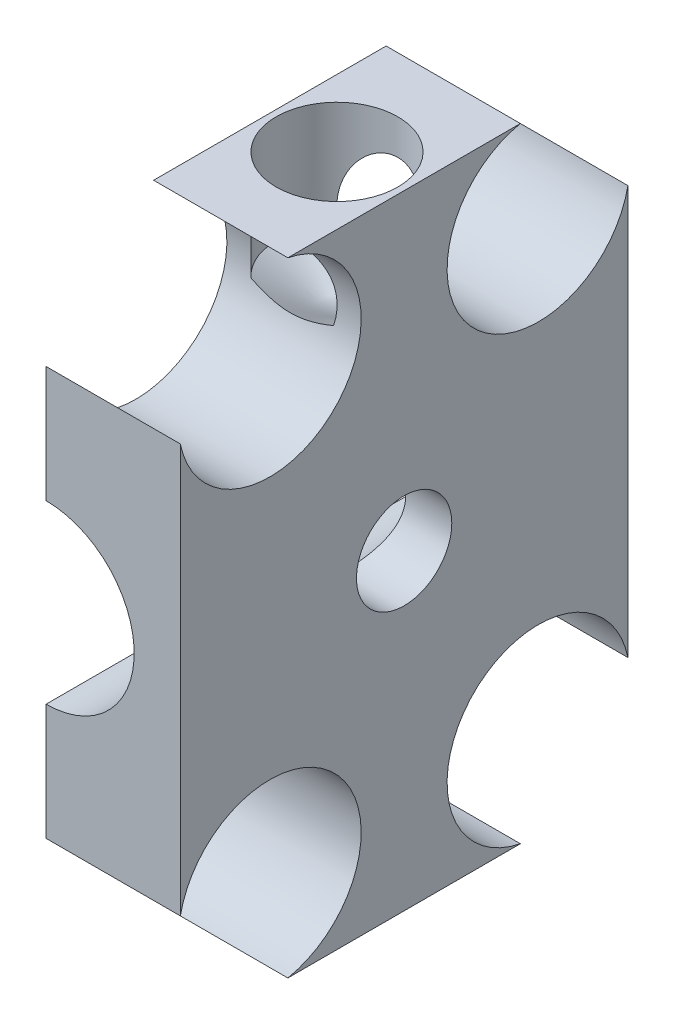
ISO-10303-21;
HEADER;
FILE_DESCRIPTION(('STEP AP214'),'2;1');
FILE_NAME('part.step','',(''),(''),'','','');
FILE_SCHEMA(('AUTOMOTIVE_DESIGN { 1 0 10303 214 1 1 1 1 }'));
ENDSEC;
DATA;
#1=APPLICATION_CONTEXT('core data for automotive mechanical design processes');
#2=APPLICATION_PROTOCOL_DEFINITION('international standard','automotive_design',2000,#1);
#3=PRODUCT_CONTEXT('',#1,'mechanical');
#4=PRODUCT('Part','Part','',(#3));
#5=PRODUCT_RELATED_PRODUCT_CATEGORY('part','',(#4));
#6=PRODUCT_DEFINITION_FORMATION('','',#4);
#7=PRODUCT_DEFINITION_CONTEXT('part definition',#1,'design');
#8=PRODUCT_DEFINITION('design','',#6,#7);
#9=PRODUCT_DEFINITION_SHAPE('','',#8);
#10=(LENGTH_UNIT() NAMED_UNIT(*) SI_UNIT(.MILLI.,.METRE.));
#11=(NAMED_UNIT(*) PLANE_ANGLE_UNIT() SI_UNIT($,.RADIAN.));
#12=(NAMED_UNIT(*) SI_UNIT($,.STERADIAN.) SOLID_ANGLE_UNIT());
#13=UNCERTAINTY_MEASURE_WITH_UNIT(LENGTH_MEASURE(1.E-05),#10,'distance_accuracy_value','');
#14=(GEOMETRIC_REPRESENTATION_CONTEXT(3) GLOBAL_UNCERTAINTY_ASSIGNED_CONTEXT((#13)) GLOBAL_UNIT_ASSIGNED_CONTEXT((#10,
#11,#12)) REPRESENTATION_CONTEXT('',''));
#15=CARTESIAN_POINT('',(0.,0.,0.));
#16=DIRECTION('',(0.,0.,1.));
#17=DIRECTION('',(1.,0.,0.));
#18=AXIS2_PLACEMENT_3D('',#15,#16,#17);
#19=CARTESIAN_POINT('',(0.,0.,6.35));
#20=DIRECTION('',(0.,0.,1.));
#21=DIRECTION('',(1.,0.,0.));
#22=AXIS2_PLACEMENT_3D('',#19,#20,#21);
#23=PLANE('',#22);
#24=DIRECTION('',(1.,0.,0.));
#25=VECTOR('',#24,1.);
#26=CARTESIAN_POINT('',(3.81,5.79946131844707,6.35));
#27=LINE('',#26,#25);
#28=CARTESIAN_POINT('',(0.,5.79946131844707,6.35));
#29=VERTEX_POINT('',#28);
#30=CARTESIAN_POINT('',(3.81,5.79946131844707,6.35));
#31=VERTEX_POINT('',#30);
#32=EDGE_CURVE('E139',#29,#31,#27,.T.);
#33=ORIENTED_EDGE('',*,*,#32,.F.);
#34=DIRECTION('',(0.,1.,0.));
#35=VECTOR('',#34,1.);
#36=CARTESIAN_POINT('',(0.,0.,6.35));
#37=LINE('',#36,#35);
#38=CARTESIAN_POINT('',(0.,2.499995,6.35));
#39=VERTEX_POINT('',#38);
#40=EDGE_CURVE('E170',#39,#29,#37,.T.);
#41=ORIENTED_EDGE('',*,*,#40,.F.);
#42=CARTESIAN_POINT('',(0.,0.,6.35));
#43=DIRECTION('',(0.,0.,1.));
#44=DIRECTION('',(1.,0.,0.));
#45=AXIS2_PLACEMENT_3D('',#42,#43,#44);
#46=CIRCLE('',#45,2.499995);
#47=CARTESIAN_POINT('',(0.,-2.499995,6.35));
#48=VERTEX_POINT('',#47);
#49=EDGE_CURVE('E262',#48,#39,#46,.T.);
#50=ORIENTED_EDGE('',*,*,#49,.F.);
#51=DIRECTION('',(0.,1.,0.));
#52=VECTOR('',#51,1.);
#53=CARTESIAN_POINT('',(0.,0.,6.35));
#54=LINE('',#53,#52);
#55=CARTESIAN_POINT('',(0.,-5.79946131844707,6.35));
#56=VERTEX_POINT('',#55);
#57=EDGE_CURVE('E245',#56,#48,#54,.T.);
#58=ORIENTED_EDGE('',*,*,#57,.F.);
#59=DIRECTION('',(1.,0.,0.));
#60=VECTOR('',#59,1.);
#61=CARTESIAN_POINT('',(3.81,-5.79946131844707,6.35));
#62=LINE('',#61,#60);
#63=CARTESIAN_POINT('',(3.81,-5.79946131844706,6.35));
#64=VERTEX_POINT('',#63);
#65=EDGE_CURVE('E159',#64,#56,#62,.F.);
#66=ORIENTED_EDGE('',*,*,#65,.F.);
#67=DIRECTION('',(0.,-1.,0.));
#68=VECTOR('',#67,1.);
#69=CARTESIAN_POINT('',(3.81,0.,6.35));
#70=LINE('',#69,#68);
#71=EDGE_CURVE('E152',#31,#64,#70,.T.);
#72=ORIENTED_EDGE('',*,*,#71,.F.);
#73=EDGE_LOOP('',(#33,#41,#50,#58,#66,#72));
#74=FACE_BOUND('',#73,.T.);
#75=ADVANCED_FACE('F47',(#74),#23,.T.);
#76=CARTESIAN_POINT('',(3.81,0.,6.35));
#77=DIRECTION('',(1.,0.,0.));
#78=DIRECTION('',(0.,0.,-1.));
#79=AXIS2_PLACEMENT_3D('',#76,#77,#78);
#80=PLANE('',#79);
#81=CARTESIAN_POINT('',(3.81,6.309995,3.81));
#82=DIRECTION('',(1.,0.,0.));
#83=DIRECTION('',(0.,0.,-1.));
#84=AXIS2_PLACEMENT_3D('',#81,#82,#83);
#85=CIRCLE('',#84,2.5908);
#86=CARTESIAN_POINT('',(3.81,8.849995,3.29946631844707));
#87=VERTEX_POINT('',#86);
#88=EDGE_CURVE('E52',#31,#87,#85,.T.);
#89=ORIENTED_EDGE('',*,*,#88,.F.);
#90=ORIENTED_EDGE('',*,*,#71,.T.);
#91=CARTESIAN_POINT('',(3.81,-6.309995,3.81));
#92=DIRECTION('',(1.,0.,0.));
#93=DIRECTION('',(0.,0.,-1.));
#94=AXIS2_PLACEMENT_3D('',#91,#92,#93);
#95=CIRCLE('',#94,2.5908);
#96=CARTESIAN_POINT('',(3.81,-8.849995,3.29946631844707));
#97=VERTEX_POINT('',#96);
#98=EDGE_CURVE('E237',#97,#64,#95,.T.);
#99=ORIENTED_EDGE('',*,*,#98,.F.);
#100=DIRECTION('',(0.,0.,-1.));
#101=VECTOR('',#100,1.);
#102=CARTESIAN_POINT('',(3.81,-8.849995,6.35));
#103=LINE('',#102,#101);
#104=CARTESIAN_POINT('',(3.81,-8.849995,-3.29946631844707));
#105=VERTEX_POINT('',#104);
#106=EDGE_CURVE('E161',#97,#105,#103,.T.);
#107=ORIENTED_EDGE('',*,*,#106,.T.);
#108=CARTESIAN_POINT('',(3.81,-6.309995,-3.81));
#109=DIRECTION('',(1.,0.,0.));
#110=DIRECTION('',(0.,0.,-1.));
#111=AXIS2_PLACEMENT_3D('',#108,#109,#110);
#112=CIRCLE('',#111,2.5908);
#113=CARTESIAN_POINT('',(3.81,-5.79946131844706,-6.35));
#114=VERTEX_POINT('',#113);
#115=EDGE_CURVE('E337',#114,#105,#112,.T.);
#116=ORIENTED_EDGE('',*,*,#115,.F.);
#117=DIRECTION('',(0.,-1.,0.));
#118=VECTOR('',#117,1.);
#119=CARTESIAN_POINT('',(3.81,0.,-6.35));
#120=LINE('',#119,#118);
#121=CARTESIAN_POINT('',(3.81,5.79946131844707,-6.35));
#122=VERTEX_POINT('',#121);
#123=EDGE_CURVE('E169',#122,#114,#120,.T.);
#124=ORIENTED_EDGE('',*,*,#123,.F.);
#125=CARTESIAN_POINT('',(3.81,6.309995,-3.81));
#126=DIRECTION('',(1.,0.,0.));
#127=DIRECTION('',(0.,0.,-1.));
#128=AXIS2_PLACEMENT_3D('',#125,#126,#127);
#129=CIRCLE('',#128,2.5908);
#130=CARTESIAN_POINT('',(3.81,8.849995,-3.29946631844707));
#131=VERTEX_POINT('',#130);
#132=EDGE_CURVE('E331',#131,#122,#129,.T.);
#133=ORIENTED_EDGE('',*,*,#132,.F.);
#134=DIRECTION('',(0.,0.,-1.));
#135=VECTOR('',#134,1.);
#136=CARTESIAN_POINT('',(3.81,8.849995,6.35));
#137=LINE('',#136,#135);
#138=EDGE_CURVE('E155',#87,#131,#137,.T.);
#139=ORIENTED_EDGE('',*,*,#138,.F.);
#140=EDGE_LOOP('',(#89,#90,#99,#107,#116,#124,#133,#139));
#141=FACE_BOUND('',#140,.T.);
#142=CARTESIAN_POINT('',(3.81,0.,0.));
#143=DIRECTION('',(1.,0.,0.));
#144=DIRECTION('',(0.,0.,-1.));
#145=AXIS2_PLACEMENT_3D('',#142,#143,#144);
#146=CIRCLE('',#145,1.35255);
#147=CARTESIAN_POINT('',(3.81,0.,-1.35255));
#148=VERTEX_POINT('',#147);
#149=EDGE_CURVE('E251',#148,#148,#146,.T.);
#150=ORIENTED_EDGE('',*,*,#149,.F.);
#151=EDGE_LOOP('',(#150));
#152=FACE_BOUND('',#151,.T.);
#153=ADVANCED_FACE('F149',(#141,#152),#80,.T.);
#154=CARTESIAN_POINT('',(0.,8.849995,6.35));
#155=DIRECTION('',(0.,1.,0.));
#156=DIRECTION('',(0.,0.,1.));
#157=AXIS2_PLACEMENT_3D('',#154,#155,#156);
#158=PLANE('',#157);
#159=DIRECTION('',(1.,0.,0.));
#160=VECTOR('',#159,1.);
#161=CARTESIAN_POINT('',(3.81,8.849995,3.29946631844707));
#162=LINE('',#161,#160);
#163=CARTESIAN_POINT('',(0.,8.849995,3.29946631844707));
#164=VERTEX_POINT('',#163);
#165=EDGE_CURVE('E59',#87,#164,#162,.F.);
#166=ORIENTED_EDGE('',*,*,#165,.F.);
#167=ORIENTED_EDGE('',*,*,#138,.T.);
#168=DIRECTION('',(1.,0.,0.));
#169=VECTOR('',#168,1.);
#170=CARTESIAN_POINT('',(3.81,8.849995,-3.29946631844707));
#171=LINE('',#170,#169);
#172=CARTESIAN_POINT('',(0.,8.849995,-3.29946631844707));
#173=VERTEX_POINT('',#172);
#174=EDGE_CURVE('E244',#173,#131,#171,.T.);
#175=ORIENTED_EDGE('',*,*,#174,.F.);
#176=DIRECTION('',(0.,0.,-1.));
#177=VECTOR('',#176,1.);
#178=CARTESIAN_POINT('',(0.,8.849995,6.35));
#179=LINE('',#178,#177);
#180=EDGE_CURVE('E174',#164,#173,#179,.T.);
#181=ORIENTED_EDGE('',*,*,#180,.F.);
#182=EDGE_LOOP('',(#166,#167,#175,#181));
#183=FACE_BOUND('',#182,.T.);
#184=CARTESIAN_POINT('',(1.905,8.849995,0.));
#185=DIRECTION('',(0.,1.,0.));
#186=DIRECTION('',(0.,0.,1.));
#187=AXIS2_PLACEMENT_3D('',#184,#185,#186);
#188=CIRCLE('',#187,1.72719999999999);
#189=CARTESIAN_POINT('',(1.905,8.849995,1.72719999999999));
#190=VERTEX_POINT('',#189);
#191=EDGE_CURVE('E234',#190,#190,#188,.T.);
#192=ORIENTED_EDGE('',*,*,#191,.F.);
#193=EDGE_LOOP('',(#192));
#194=FACE_BOUND('',#193,.T.);
#195=ADVANCED_FACE('F299',(#183,#194),#158,.T.);
#196=CARTESIAN_POINT('',(0.,0.,-6.35));
#197=DIRECTION('',(0.,0.,1.));
#198=DIRECTION('',(1.,0.,0.));
#199=AXIS2_PLACEMENT_3D('',#196,#197,#198);
#200=PLANE('',#199);
#201=ORIENTED_EDGE('',*,*,#123,.T.);
#202=DIRECTION('',(1.,0.,0.));
#203=VECTOR('',#202,1.);
#204=CARTESIAN_POINT('',(3.81,-5.79946131844707,-6.35));
#205=LINE('',#204,#203);
#206=CARTESIAN_POINT('',(0.,-5.79946131844707,-6.35));
#207=VERTEX_POINT('',#206);
#208=EDGE_CURVE('E235',#114,#207,#205,.F.);
#209=ORIENTED_EDGE('',*,*,#208,.T.);
#210=DIRECTION('',(0.,1.,0.));
#211=VECTOR('',#210,1.);
#212=CARTESIAN_POINT('',(0.,0.,-6.35));
#213=LINE('',#212,#211);
#214=CARTESIAN_POINT('',(0.,-2.499995,-6.35));
#215=VERTEX_POINT('',#214);
#216=EDGE_CURVE('E271',#207,#215,#213,.T.);
#217=ORIENTED_EDGE('',*,*,#216,.T.);
#218=CARTESIAN_POINT('',(0.,0.,-6.35));
#219=DIRECTION('',(0.,0.,1.));
#220=DIRECTION('',(1.,0.,0.));
#221=AXIS2_PLACEMENT_3D('',#218,#219,#220);
#222=CIRCLE('',#221,2.499995);
#223=CARTESIAN_POINT('',(0.,2.499995,-6.35));
#224=VERTEX_POINT('',#223);
#225=EDGE_CURVE('E267',#215,#224,#222,.T.);
#226=ORIENTED_EDGE('',*,*,#225,.T.);
#227=DIRECTION('',(0.,1.,0.));
#228=VECTOR('',#227,1.);
#229=CARTESIAN_POINT('',(0.,0.,-6.35));
#230=LINE('',#229,#228);
#231=CARTESIAN_POINT('',(0.,5.79946131844707,-6.35));
#232=VERTEX_POINT('',#231);
#233=EDGE_CURVE('E213',#224,#232,#230,.T.);
#234=ORIENTED_EDGE('',*,*,#233,.T.);
#235=DIRECTION('',(1.,0.,0.));
#236=VECTOR('',#235,1.);
#237=CARTESIAN_POINT('',(3.81,5.79946131844707,-6.35));
#238=LINE('',#237,#236);
#239=EDGE_CURVE('E211',#232,#122,#238,.T.);
#240=ORIENTED_EDGE('',*,*,#239,.T.);
#241=EDGE_LOOP('',(#201,#209,#217,#226,#234,#240));
#242=FACE_BOUND('',#241,.T.);
#243=ADVANCED_FACE('F296',(#242),#200,.F.);
#244=CARTESIAN_POINT('',(0.,0.,6.35));
#245=DIRECTION('',(-1.,0.,0.));
#246=DIRECTION('',(0.,0.,1.));
#247=AXIS2_PLACEMENT_3D('',#244,#245,#246);
#248=PLANE('',#247);
#249=CARTESIAN_POINT('',(0.,-6.309995,-3.81));
#250=DIRECTION('',(-1.,0.,0.));
#251=DIRECTION('',(0.,0.,1.));
#252=AXIS2_PLACEMENT_3D('',#249,#250,#251);
#253=CIRCLE('',#252,2.5908);
#254=CARTESIAN_POINT('',(0.,-8.849995,-3.29946631844707));
#255=VERTEX_POINT('',#254);
#256=EDGE_CURVE('E145',#255,#207,#253,.T.);
#257=ORIENTED_EDGE('',*,*,#256,.F.);
#258=DIRECTION('',(0.,0.,-1.));
#259=VECTOR('',#258,1.);
#260=CARTESIAN_POINT('',(0.,-8.849995,6.35));
#261=LINE('',#260,#259);
#262=CARTESIAN_POINT('',(0.,-8.849995,3.29946631844707));
#263=VERTEX_POINT('',#262);
#264=EDGE_CURVE('E266',#263,#255,#261,.T.);
#265=ORIENTED_EDGE('',*,*,#264,.F.);
#266=CARTESIAN_POINT('',(0.,-6.309995,3.81));
#267=DIRECTION('',(-1.,0.,0.));
#268=DIRECTION('',(0.,0.,1.));
#269=AXIS2_PLACEMENT_3D('',#266,#267,#268);
#270=CIRCLE('',#269,2.5908);
#271=EDGE_CURVE('E241',#56,#263,#270,.T.);
#272=ORIENTED_EDGE('',*,*,#271,.F.);
#273=ORIENTED_EDGE('',*,*,#57,.T.);
#274=DIRECTION('',(0.,0.,-1.));
#275=VECTOR('',#274,1.);
#276=CARTESIAN_POINT('',(0.,-2.499995,6.35));
#277=LINE('',#276,#275);
#278=EDGE_CURVE('E248',#48,#215,#277,.T.);
#279=ORIENTED_EDGE('',*,*,#278,.T.);
#280=ORIENTED_EDGE('',*,*,#216,.F.);
#281=EDGE_LOOP('',(#257,#265,#272,#273,#279,#280));
#282=FACE_BOUND('',#281,.T.);
#283=ADVANCED_FACE('F294',(#282),#248,.T.);
#284=CARTESIAN_POINT('',(0.,-8.849995,6.35));
#285=DIRECTION('',(0.,-1.,0.));
#286=DIRECTION('',(0.,0.,-1.));
#287=AXIS2_PLACEMENT_3D('',#284,#285,#286);
#288=PLANE('',#287);
#289=DIRECTION('',(1.,0.,0.));
#290=VECTOR('',#289,1.);
#291=CARTESIAN_POINT('',(3.81,-8.849995,-3.29946631844707));
#292=LINE('',#291,#290);
#293=EDGE_CURVE('E339',#105,#255,#292,.F.);
#294=ORIENTED_EDGE('',*,*,#293,.F.);
#295=ORIENTED_EDGE('',*,*,#106,.F.);
#296=DIRECTION('',(1.,0.,0.));
#297=VECTOR('',#296,1.);
#298=CARTESIAN_POINT('',(3.81,-8.849995,3.29946631844707));
#299=LINE('',#298,#297);
#300=EDGE_CURVE('E240',#263,#97,#299,.T.);
#301=ORIENTED_EDGE('',*,*,#300,.F.);
#302=ORIENTED_EDGE('',*,*,#264,.T.);
#303=EDGE_LOOP('',(#294,#295,#301,#302));
#304=FACE_BOUND('',#303,.T.);
#305=ADVANCED_FACE('F291',(#304),#288,.T.);
#306=CARTESIAN_POINT('',(0.,0.,6.35));
#307=DIRECTION('',(0.,0.,-1.));
#308=DIRECTION('',(-1.,0.,0.));
#309=AXIS2_PLACEMENT_3D('',#306,#307,#308);
#310=CYLINDRICAL_SURFACE('',#309,2.499995);
#311=CARTESIAN_POINT('',(2.499995,0.,-1.35255));
#312=CARTESIAN_POINT('',(2.4999909417952,-0.0703879854908671,-1.35254547654858));
#313=CARTESIAN_POINT('',(2.49699175387842,-0.140837953186034,-1.34702354530672));
#314=CARTESIAN_POINT('',(2.48528915677381,-0.279610593337236,-1.32520194487222));
#315=CARTESIAN_POINT('',(2.47657739390966,-0.347929996699159,-1.30888649166548));
#316=CARTESIAN_POINT('',(2.45435024710423,-0.480232220483703,-1.26632484428661));
#317=CARTESIAN_POINT('',(2.44085448417952,-0.544231501662716,-1.24011918565623));
#318=CARTESIAN_POINT('',(2.4102582135294,-0.666803425482456,-1.17875667214856));
#319=CARTESIAN_POINT('',(2.39315762466794,-0.725375945937003,-1.14359961579294));
#320=CARTESIAN_POINT('',(2.35551902442998,-0.83986699701009,-1.06266453772066));
#321=CARTESIAN_POINT('',(2.33482707539279,-0.895341133167189,-1.01633068841118));
#322=CARTESIAN_POINT('',(2.29276302610907,-0.998150314810456,-0.915574111767863));
#323=CARTESIAN_POINT('',(2.27139033218946,-1.04547801199676,-0.861144163172528));
#324=CARTESIAN_POINT('',(2.22802227102003,-1.13516552630285,-0.739607520961648));
#325=CARTESIAN_POINT('',(2.20615906586732,-1.17663265559082,-0.671788849342804));
#326=CARTESIAN_POINT('',(2.16693209187687,-1.24740812580324,-0.528874433738393));
#327=CARTESIAN_POINT('',(2.14956480839281,-1.27672597515602,-0.453784437533482));
#328=CARTESIAN_POINT('',(2.12305705429654,-1.32031153876476,-0.303175886947697));
#329=CARTESIAN_POINT('',(2.11346795145699,-1.33540968327565,-0.227981175996748));
#330=CARTESIAN_POINT('',(2.10251079692312,-1.35260504099723,-0.0755693134265723));
#331=CARTESIAN_POINT('',(2.10113173945947,-1.35471965906621,0.00164499126287952));
#332=CARTESIAN_POINT('',(2.10640355153818,-1.34649347176087,0.143731859929031));
#333=CARTESIAN_POINT('',(2.11191195204005,-1.33792530028466,0.208761092329506));
#334=CARTESIAN_POINT('',(2.12829808822594,-1.31170086618424,0.336259264264827));
#335=CARTESIAN_POINT('',(2.13917810976783,-1.29404073439939,0.398727101547353));
#336=CARTESIAN_POINT('',(2.16528093213309,-1.2498799431391,0.521074954059483));
#337=CARTESIAN_POINT('',(2.18059436381576,-1.22319259735765,0.580867310954306));
#338=CARTESIAN_POINT('',(2.21386482490899,-1.16189197944697,0.695431077072122));
#339=CARTESIAN_POINT('',(2.23182301257873,-1.12727523096321,0.750200269281502));
#340=CARTESIAN_POINT('',(2.27164279923057,-1.04498998351744,0.861918053175414));
#341=CARTESIAN_POINT('',(2.29368300703626,-0.996137723794657,0.917934353382224));
#342=CARTESIAN_POINT('',(2.33701607327133,-0.889737679311177,1.02140573477245));
#343=CARTESIAN_POINT('',(2.35830844360215,-0.832184340883776,1.06885530529083));
#344=CARTESIAN_POINT('',(2.39936643900902,-0.705490975530968,1.15671025296739));
#345=CARTESIAN_POINT('',(2.41895162974972,-0.635849684512623,1.19648432311302));
#346=CARTESIAN_POINT('',(2.45274040459833,-0.489546582115155,1.26340373944106));
#347=CARTESIAN_POINT('',(2.46694890901077,-0.41289126957455,1.29056063704003));
#348=CARTESIAN_POINT('',(2.4872576260959,-0.262230952139805,1.32894908875345));
#349=CARTESIAN_POINT('',(2.49398029731656,-0.188624204053558,1.3414094669068));
#350=CARTESIAN_POINT('',(2.50077665237163,-0.0400743499299487,1.35400571303525));
#351=CARTESIAN_POINT('',(2.50085436246898,0.0348679193624996,1.35414904405963));
#352=CARTESIAN_POINT('',(2.49467312946835,0.176440456468771,1.34269394270928));
#353=CARTESIAN_POINT('',(2.48900859984121,0.243190360257094,1.33219695920549));
#354=CARTESIAN_POINT('',(2.47276573429862,0.373814872855549,1.30159698728912));
#355=CARTESIAN_POINT('',(2.46218689378422,0.437689185662504,1.28149301242944));
#356=CARTESIAN_POINT('',(2.43673138967285,0.56256183283884,1.23188450927183));
#357=CARTESIAN_POINT('',(2.42175823922533,0.62345524002044,1.20216721058017));
#358=CARTESIAN_POINT('',(2.38886448517946,0.739559436343362,1.1344450819809));
#359=CARTESIAN_POINT('',(2.37094276429433,0.794768058434945,1.09643710874457));
#360=CARTESIAN_POINT('',(2.33148466761163,0.904382499660284,1.00843981683581));
#361=CARTESIAN_POINT('',(2.30976743234877,0.958036005181737,0.957593575258703));
#362=CARTESIAN_POINT('',(2.26644918154136,1.05644693728278,0.84779405512753));
#363=CARTESIAN_POINT('',(2.24484829992829,1.10119564075325,0.78883292194691));
#364=CARTESIAN_POINT('',(2.20254359895675,1.18367104078955,0.659261807736754));
#365=CARTESIAN_POINT('',(2.18201649300806,1.22065968518861,0.588118649246095));
#366=CARTESIAN_POINT('',(2.14669371530733,1.28177270904628,0.439207092856885));
#367=CARTESIAN_POINT('',(2.13188978259034,1.30591564939898,0.36144844335765));
#368=CARTESIAN_POINT('',(2.11172752197848,1.33825051908923,0.209529141857859));
#369=CARTESIAN_POINT('',(2.10558785875075,1.34777008096413,0.135758853931323));
#370=CARTESIAN_POINT('',(2.10125342479613,1.35452272423138,-0.0125532494118207));
#371=CARTESIAN_POINT('',(2.10305263144254,1.35176511937746,-0.0870944371878129));
#372=CARTESIAN_POINT('',(2.11351466773017,1.33532737631793,-0.224652447697519));
#373=CARTESIAN_POINT('',(2.1212683272018,1.32309232598415,-0.287921919647346));
#374=CARTESIAN_POINT('',(2.14151945291965,1.29005526648468,-0.411381785045474));
#375=CARTESIAN_POINT('',(2.15401875832477,1.26924993567011,-0.471570974465318));
#376=CARTESIAN_POINT('',(2.18329432029195,1.21824235868599,-0.591426849397039));
#377=CARTESIAN_POINT('',(2.2002907534723,1.18752983439671,-0.650820709391653));
#378=CARTESIAN_POINT('',(2.23638386774575,1.11807600905081,-0.764010626719821));
#379=CARTESIAN_POINT('',(2.25548167282124,1.0793304013632,-0.817803658049328));
#380=CARTESIAN_POINT('',(2.29705425127217,0.988123251305441,-0.926701862105477));
#381=CARTESIAN_POINT('',(2.31960531219547,0.934475602537718,-0.980790005556026));
#382=CARTESIAN_POINT('',(2.36304594400469,0.818429765175733,-1.07952278168452));
#383=CARTESIAN_POINT('',(2.38393438135915,0.75602568543014,-1.12416100550092));
#384=CARTESIAN_POINT('',(2.42248101087233,0.621753290808111,-1.20377712737638));
#385=CARTESIAN_POINT('',(2.4400282611623,0.549663393303364,-1.23843816929756));
#386=CARTESIAN_POINT('',(2.46904288206818,0.39950503743125,-1.29467167170197));
#387=CARTESIAN_POINT('',(2.48052619243088,0.32145287675783,-1.31627846852599));
#388=CARTESIAN_POINT('',(2.4921384966697,0.202071130048963,-1.33798420669402));
#389=CARTESIAN_POINT('',(2.4950737479444,0.161915710463639,-1.34343531662796));
#390=CARTESIAN_POINT('',(2.49900317180663,0.0811804018085766,-1.35071952120396));
#391=CARTESIAN_POINT('',(2.49999734081415,0.0406005119561113,-1.35255260917317));
#392=CARTESIAN_POINT('',(2.499995,0.,-1.35255));
#393=B_SPLINE_CURVE_WITH_KNOTS('',3,(#311,#312,#313,#314,#315,#316,#317,#318,#319,#320,#321,
#322,#323,#324,#325,#326,#327,#328,#329,#330,#331,#332,#333,#334,#335,#336,#337,#338,#339,#340,
#341,#342,#343,#344,#345,#346,#347,#348,#349,#350,#351,#352,#353,#354,#355,#356,#357,#358,#359,
#360,#361,#362,#363,#364,#365,#366,#367,#368,#369,#370,#371,#372,#373,#374,#375,#376,#377,#378,
#379,#380,#381,#382,#383,#384,#385,#386,#387,#388,#389,#390,#391,#392),.UNSPECIFIED.,.T.,.F.,(4,
2,2,2,2,2,2,2,2,2,2,2,2,2,2,2,2,2,2,2,2,2,2,2,2,2,2,2,2,2,2,2,2,2,2,2,2,2,2,2,4),(0.,
0.211000314890271,0.422309872280633,0.632762609066829,0.843220083148744,1.06785110910409,
1.29268370817464,1.53877227857699,1.78466788651759,2.01510163401966,2.24522640969107,
2.44176818379015,2.63839366712586,2.83936301307429,3.04042063583698,3.27201361705364,
3.50375504689302,3.7500818672523,3.99618272112068,4.21978736856393,4.44325653026468,
4.64573886520204,4.84824199552043,5.05557489236475,5.26298653452028,5.49314899510065,
5.723535823876,5.97051889340911,6.21714411863403,6.43968130105946,6.66204969020915,
6.85592006599731,7.04986565240751,7.25605411712636,7.46235340908675,7.6996463565339,
7.9370997222741,8.18142306345489,8.42510093552976,8.54680785678672,8.668515002512),.UNSPECIFIED.);
#394=CARTESIAN_POINT('',(2.499995,0.,-1.35255));
#395=VERTEX_POINT('',#394);
#396=EDGE_CURVE('E255',#395,#395,#393,.T.);
#397=ORIENTED_EDGE('',*,*,#396,.F.);
#398=EDGE_LOOP('',(#397));
#399=FACE_BOUND('',#398,.T.);
#400=ORIENTED_EDGE('',*,*,#225,.F.);
#401=ORIENTED_EDGE('',*,*,#278,.F.);
#402=ORIENTED_EDGE('',*,*,#49,.T.);
#403=DIRECTION('',(0.,0.,-1.));
#404=VECTOR('',#403,1.);
#405=CARTESIAN_POINT('',(0.,2.499995,6.35));
#406=LINE('',#405,#404);
#407=EDGE_CURVE('E177',#39,#224,#406,.T.);
#408=ORIENTED_EDGE('',*,*,#407,.T.);
#409=EDGE_LOOP('',(#400,#401,#402,#408));
#410=FACE_BOUND('',#409,.T.);
#411=ADVANCED_FACE('F196',(#399,#410),#310,.F.);
#412=CARTESIAN_POINT('',(0.,0.,6.35));
#413=DIRECTION('',(-1.,0.,0.));
#414=DIRECTION('',(0.,0.,1.));
#415=AXIS2_PLACEMENT_3D('',#412,#413,#414);
#416=PLANE('',#415);
#417=CARTESIAN_POINT('',(0.,6.309995,3.81));
#418=DIRECTION('',(-1.,0.,0.));
#419=DIRECTION('',(0.,0.,1.));
#420=AXIS2_PLACEMENT_3D('',#417,#418,#419);
#421=CIRCLE('',#420,2.5908);
#422=EDGE_CURVE('E11',#164,#29,#421,.T.);
#423=ORIENTED_EDGE('',*,*,#422,.F.);
#424=ORIENTED_EDGE('',*,*,#180,.T.);
#425=CARTESIAN_POINT('',(0.,6.309995,-3.81));
#426=DIRECTION('',(-1.,0.,0.));
#427=DIRECTION('',(0.,0.,1.));
#428=AXIS2_PLACEMENT_3D('',#425,#426,#427);
#429=CIRCLE('',#428,2.5908);
#430=EDGE_CURVE('E333',#232,#173,#429,.T.);
#431=ORIENTED_EDGE('',*,*,#430,.F.);
#432=ORIENTED_EDGE('',*,*,#233,.F.);
#433=ORIENTED_EDGE('',*,*,#407,.F.);
#434=ORIENTED_EDGE('',*,*,#40,.T.);
#435=EDGE_LOOP('',(#423,#424,#431,#432,#433,#434));
#436=FACE_BOUND('',#435,.T.);
#437=ADVANCED_FACE('F192',(#436),#416,.T.);
#438=CARTESIAN_POINT('',(1.905,5.801995,0.));
#439=DIRECTION('',(0.,1.,0.));
#440=DIRECTION('',(0.,0.,1.));
#441=AXIS2_PLACEMENT_3D('',#438,#439,#440);
#442=CONICAL_SURFACE('',#441,1.7272,1.02974425867665);
#443=CARTESIAN_POINT('',(1.905,4.7641885388156,0.));
#444=VERTEX_POINT('',#443);
#445=VERTEX_LOOP('',#444);
#446=FACE_BOUND('',#445,.T.);
#447=CARTESIAN_POINT('',(1.905,5.801995,0.));
#448=DIRECTION('',(0.,1.,0.));
#449=DIRECTION('',(0.,0.,1.));
#450=AXIS2_PLACEMENT_3D('',#447,#448,#449);
#451=CIRCLE('',#450,1.7272);
#452=CARTESIAN_POINT('',(0.733842549875817,5.801995,-1.26949205078984));
#453=VERTEX_POINT('',#452);
#454=CARTESIAN_POINT('',(0.73384254987581,5.801995,1.26949205078984));
#455=VERTEX_POINT('',#454);
#456=EDGE_CURVE('E173',#453,#455,#451,.T.);
#457=ORIENTED_EDGE('',*,*,#456,.T.);
#458=CARTESIAN_POINT('',(0.474538544346195,5.90597564611844,1.25089605492682));
#459=CARTESIAN_POINT('',(0.521807777010727,5.88585589399778,1.25407074273982));
#460=CARTESIAN_POINT('',(0.569277009544752,5.86623428315521,1.25741375841798));
#461=CARTESIAN_POINT('',(0.664687872972967,5.82817009106365,1.26432479159187));
#462=CARTESIAN_POINT('',(0.712629660769705,5.809727917763,1.26789288610014));
#463=CARTESIAN_POINT('',(0.857712727599076,5.75628502521703,1.27880045917297));
#464=CARTESIAN_POINT('',(0.955632957596704,5.72337612710432,1.28630870908956));
#465=CARTESIAN_POINT('',(1.15243751622603,5.66552957380874,1.30046071151531));
#466=CARTESIAN_POINT('',(1.25128990519797,5.64048820736043,1.30711496191744));
#467=CARTESIAN_POINT('',(1.45093465811911,5.60006143085684,1.31827566396022));
#468=CARTESIAN_POINT('',(1.55172236720564,5.58465526741407,1.32278672676408));
#469=CARTESIAN_POINT('',(1.73575792983735,5.56707892424383,1.32798724810946));
#470=CARTESIAN_POINT('',(1.81880456097399,5.56298864835367,1.32922894529631));
#471=CARTESIAN_POINT('',(1.98493894541137,5.56279099799127,1.329288012331));
#472=CARTESIAN_POINT('',(2.06802670339268,5.56668616131558,1.32810461147546));
#473=CARTESIAN_POINT('',(2.23352076075436,5.58210415039463,1.32354052725487));
#474=CARTESIAN_POINT('',(2.31592595896982,5.59363751597272,1.32015680782533));
#475=CARTESIAN_POINT('',(2.47942288921198,5.62337017765476,1.31179555717042));
#476=CARTESIAN_POINT('',(2.56051444272227,5.64157037193579,1.30681781120394));
#477=CARTESIAN_POINT('',(2.70040557121917,5.6780188363411,1.29741027205518));
#478=CARTESIAN_POINT('',(2.7595473333617,5.69503774510866,1.29317161914526));
#479=CARTESIAN_POINT('',(2.87701888930959,5.7316048247666,1.28451735548003));
#480=CARTESIAN_POINT('',(2.93534878849278,5.75115266395239,1.28010176798451));
#481=CARTESIAN_POINT('',(3.05103013267428,5.79227045044101,1.27136961700111));
#482=CARTESIAN_POINT('',(3.1083845396389,5.81383207524631,1.26705273037433));
#483=CARTESIAN_POINT('',(3.22240991177591,5.85868885298415,1.25870729558624));
#484=CARTESIAN_POINT('',(3.27908112049868,5.8819833655741,1.25467864198506));
#485=CARTESIAN_POINT('',(3.3354614556538,5.90597564611844,1.25089605492682));
#486=B_SPLINE_CURVE_WITH_KNOTS('',3,(#458,#459,#460,#461,#462,#463,#464,#465,#466,#467,#468,
#469,#470,#471,#472,#473,#474,#475,#476,#477,#478,#479,#480,#481,#482,#483,#484,#485),
.UNSPECIFIED.,.F.,.F.,(4,2,2,2,2,2,2,2,2,2,2,2,2,4),(0.,0.154406328898436,0.308865778782247,
0.619352344524429,0.92555528217288,1.23109639318232,1.48016447702674,1.72931172772572,
1.97880349073281,2.22832887846037,2.41333201526317,2.59831091087252,2.78255657563163,
2.96673449230075),.UNSPECIFIED.);
#487=CARTESIAN_POINT('',(3.07615745012418,5.801995,1.26949205078984));
#488=VERTEX_POINT('',#487);
#489=EDGE_CURVE('E66',#455,#488,#486,.T.);
#490=ORIENTED_EDGE('',*,*,#489,.T.);
#491=CARTESIAN_POINT('',(3.07615745012419,5.801995,-1.26949205078984));
#492=VERTEX_POINT('',#491);
#493=EDGE_CURVE('E185',#488,#492,#451,.T.);
#494=ORIENTED_EDGE('',*,*,#493,.T.);
#495=CARTESIAN_POINT('',(3.3354614556538,5.90597564611844,-1.25089605492682));
#496=CARTESIAN_POINT('',(3.28819222298927,5.88585589399778,-1.25407074273982));
#497=CARTESIAN_POINT('',(3.24072299045525,5.86623428315521,-1.25741375841798));
#498=CARTESIAN_POINT('',(3.14531212702703,5.82817009106365,-1.26432479159186));
#499=CARTESIAN_POINT('',(3.09737033923029,5.809727917763,-1.26789288610014));
#500=CARTESIAN_POINT('',(2.95228727240092,5.75628502521703,-1.27880045917297));
#501=CARTESIAN_POINT('',(2.8543670424033,5.72337612710432,-1.28630870908956));
#502=CARTESIAN_POINT('',(2.65756248377397,5.66552957380874,-1.30046071151531));
#503=CARTESIAN_POINT('',(2.55871009480203,5.64048820736043,-1.30711496191744));
#504=CARTESIAN_POINT('',(2.35906534188089,5.60006143085684,-1.31827566396022));
#505=CARTESIAN_POINT('',(2.25827763279436,5.58465526741407,-1.32278672676408));
#506=CARTESIAN_POINT('',(2.07424207016265,5.56707892424383,-1.32798724810946));
#507=CARTESIAN_POINT('',(1.99119543902601,5.56298864835367,-1.32922894529631));
#508=CARTESIAN_POINT('',(1.82506105458863,5.56279099799127,-1.329288012331));
#509=CARTESIAN_POINT('',(1.74197329660732,5.56668616131558,-1.32810461147546));
#510=CARTESIAN_POINT('',(1.57647923924564,5.58210415039463,-1.32354052725487));
#511=CARTESIAN_POINT('',(1.49407404103018,5.59363751597272,-1.32015680782533));
#512=CARTESIAN_POINT('',(1.33057711078802,5.62337017765476,-1.31179555717042));
#513=CARTESIAN_POINT('',(1.24948555727773,5.64157037193579,-1.30681781120394));
#514=CARTESIAN_POINT('',(1.10959442878083,5.6780188363411,-1.29741027205518));
#515=CARTESIAN_POINT('',(1.0504526666383,5.69503774510866,-1.29317161914526));
#516=CARTESIAN_POINT('',(0.932981110690407,5.7316048247666,-1.28451735548003));
#517=CARTESIAN_POINT('',(0.874651211507221,5.75115266395239,-1.28010176798451));
#518=CARTESIAN_POINT('',(0.758969867325721,5.79227045044101,-1.27136961700111));
#519=CARTESIAN_POINT('',(0.701615460361103,5.81383207524631,-1.26705273037433));
#520=CARTESIAN_POINT('',(0.587590088224094,5.85868885298415,-1.25870729558624));
#521=CARTESIAN_POINT('',(0.530918879501321,5.8819833655741,-1.25467864198506));
#522=CARTESIAN_POINT('',(0.474538544346195,5.90597564611844,-1.25089605492682));
#523=B_SPLINE_CURVE_WITH_KNOTS('',3,(#495,#496,#497,#498,#499,#500,#501,#502,#503,#504,#505,
#506,#507,#508,#509,#510,#511,#512,#513,#514,#515,#516,#517,#518,#519,#520,#521,#522),
.UNSPECIFIED.,.F.,.F.,(4,2,2,2,2,2,2,2,2,2,2,2,2,4),(0.,0.154406328898436,0.308865778782247,
0.61935234452443,0.925555282172881,1.23109639318232,1.48016447702674,1.72931172772572,
1.97880349073281,2.22832887846037,2.41333201526317,2.59831091087252,2.78255657563163,
2.96673449230075),.UNSPECIFIED.);
#524=EDGE_CURVE('E201',#492,#453,#523,.T.);
#525=ORIENTED_EDGE('',*,*,#524,.T.);
#526=EDGE_LOOP('',(#457,#490,#494,#525));
#527=FACE_BOUND('',#526,.T.);
#528=ADVANCED_FACE('F186',(#446,#527),#442,.F.);
#529=CARTESIAN_POINT('',(1.905,8.849995,0.));
#530=DIRECTION('',(0.,1.,0.));
#531=DIRECTION('',(0.,0.,1.));
#532=AXIS2_PLACEMENT_3D('',#529,#530,#531);
#533=CYLINDRICAL_SURFACE('',#532,1.72719999999999);
#534=ORIENTED_EDGE('',*,*,#493,.F.);
#535=CARTESIAN_POINT('',(3.07615745012418,5.801995,1.26949205078984));
#536=CARTESIAN_POINT('',(3.08667319157559,5.85057312571945,1.25976773214521));
#537=CARTESIAN_POINT('',(3.09551610321166,5.8997690198066,1.25139004811578));
#538=CARTESIAN_POINT('',(3.11001504370872,5.99900992692365,1.23744700525404));
#539=CARTESIAN_POINT('',(3.11567189164001,6.04905471830877,1.23188092365556));
#540=CARTESIAN_POINT('',(3.1239732979605,6.1497606330317,1.2236645547766));
#541=CARTESIAN_POINT('',(3.12661013691879,6.20042300275515,1.22102174023228));
#542=CARTESIAN_POINT('',(3.12890895281082,6.30187278813441,1.21871507786516));
#543=CARTESIAN_POINT('',(3.12857071858436,6.35266021241039,1.21905144149395));
#544=CARTESIAN_POINT('',(3.12310303890822,6.50463476591544,1.22454115728531));
#545=CARTESIAN_POINT('',(3.11353219752294,6.60557777428803,1.23416347024511));
#546=CARTESIAN_POINT('',(3.08155546489053,6.80357019590479,1.26468350482605));
#547=CARTESIAN_POINT('',(3.05916524538914,6.90062420873393,1.28556745723426));
#548=CARTESIAN_POINT('',(3.00558120531289,7.0684671193685,1.33150513149346));
#549=CARTESIAN_POINT('',(2.97709829512033,7.14058752812751,1.35485100521091));
#550=CARTESIAN_POINT('',(2.90945843335487,7.27801237028659,1.40572710909563));
#551=CARTESIAN_POINT('',(2.87031747598753,7.34332681572517,1.43325104220492));
#552=CARTESIAN_POINT('',(2.78788153083588,7.45476978043707,1.48515934677755));
#553=CARTESIAN_POINT('',(2.74632615549112,7.50228734827435,1.5093163749335));
#554=CARTESIAN_POINT('',(2.65514235995139,7.58948201410454,1.55664307319203));
#555=CARTESIAN_POINT('',(2.6055160511278,7.62916115664813,1.57981299952717));
#556=CARTESIAN_POINT('',(2.49860760680646,7.69962793507463,1.62301752186017));
#557=CARTESIAN_POINT('',(2.44128432026838,7.73036475149144,1.64303391241497));
#558=CARTESIAN_POINT('',(2.32074153992042,7.78173896482563,1.67758743430174));
#559=CARTESIAN_POINT('',(2.25752411046694,7.80237988201422,1.69212647508708));
#560=CARTESIAN_POINT('',(2.13413042333148,7.83148999549412,1.71295828720052));
#561=CARTESIAN_POINT('',(2.07431389173926,7.84099571520932,1.71994738344606));
#562=CARTESIAN_POINT('',(1.95354227146039,7.85135789344658,1.72757608349945));
#563=CARTESIAN_POINT('',(1.89258754288818,7.8522170427166,1.72821766260603));
#564=CARTESIAN_POINT('',(1.7741903047446,7.84543585185988,1.72321303812226));
#565=CARTESIAN_POINT('',(1.7167133055393,7.83817678939152,1.71784888530944));
#566=CARTESIAN_POINT('',(1.6040864415563,7.81586883071394,1.70173624636433));
#567=CARTESIAN_POINT('',(1.54893623841872,7.80082107137968,1.69098854604741));
#568=CARTESIAN_POINT('',(1.44205593597324,7.76305779740413,1.66491754622428));
#569=CARTESIAN_POINT('',(1.39035101675486,7.74029196209979,1.64956429692114));
#570=CARTESIAN_POINT('',(1.29194061342947,7.68757830519476,1.61557784333933));
#571=CARTESIAN_POINT('',(1.24523580417252,7.65762951589506,1.59694419721042));
#572=CARTESIAN_POINT('',(1.15511335440458,7.58934984382157,1.55674753351901));
#573=CARTESIAN_POINT('',(1.11203077579726,7.55064083477794,1.5350784663316));
#574=CARTESIAN_POINT('',(1.03265912542522,7.46697590404861,1.49140821740884));
#575=CARTESIAN_POINT('',(0.996373070120676,7.42201722395792,1.46940689286882));
#576=CARTESIAN_POINT('',(0.926339657322679,7.32096817152762,1.42387008819944));
#577=CARTESIAN_POINT('',(0.893488267175763,7.26418897020713,1.40049060230267));
#578=CARTESIAN_POINT('',(0.835668103242427,7.14566028447124,1.35685760891039));
#579=CARTESIAN_POINT('',(0.810703431476473,7.08390823447415,1.33660573092832));
#580=CARTESIAN_POINT('',(0.763907435788879,6.94502491227115,1.29701237381305));
#581=CARTESIAN_POINT('',(0.743512915205417,6.86716359127566,1.27853428565426));
#582=CARTESIAN_POINT('',(0.711518737332408,6.7082833443668,1.24871786580286));
#583=CARTESIAN_POINT('',(0.699929755630304,6.62726071042443,1.23738820347257));
#584=CARTESIAN_POINT('',(0.683483379011342,6.4496838050313,1.22118088946501));
#585=CARTESIAN_POINT('',(0.680127823509303,6.35285639961928,1.21774927855992));
#586=CARTESIAN_POINT('',(0.684129794837384,6.1597426810714,1.22176369619864));
#587=CARTESIAN_POINT('',(0.691470472293953,6.06345575624776,1.22919261661666));
#588=CARTESIAN_POINT('',(0.708357688254304,5.94062153853381,1.24550782934537));
#589=CARTESIAN_POINT('',(0.712724681934212,5.91263836668296,1.2496972038685));
#590=CARTESIAN_POINT('',(0.722495777498416,5.85703862870413,1.25894814561916));
#591=CARTESIAN_POINT('',(0.727898497526681,5.82942162594571,1.26400854981882));
#592=CARTESIAN_POINT('',(0.733842549875817,5.801995,1.26949205078984));
#593=B_SPLINE_CURVE_WITH_KNOTS('',3,(#535,#536,#537,#538,#539,#540,#541,#542,#543,#544,#545,
#546,#547,#548,#549,#550,#551,#552,#553,#554,#555,#556,#557,#558,#559,#560,#561,#562,#563,#564,
#565,#566,#567,#568,#569,#570,#571,#572,#573,#574,#575,#576,#577,#578,#579,#580,#581,#582,#583,
#584,#585,#586,#587,#588,#589,#590,#591,#592),.UNSPECIFIED.,.F.,.F.,(4,2,2,2,2,2,2,2,2,2,2,2,2,
2,2,2,2,2,2,2,2,2,2,2,2,2,2,2,4),(0.,0.151867641592118,0.303696223350171,0.455912033339515,
0.608138647157458,0.912163527715764,1.21581752771935,1.45781108690513,1.69944347629293,
1.90136835049941,2.10324048549778,2.30623840507303,2.50916549212036,2.6911445384769,
2.87306695256574,3.04679118479506,3.22049006656357,3.39534394215067,3.57022138757574,
3.75498437853112,3.93982917842973,4.14796464475424,4.35620818843017,4.60302252434608,
4.85013561565179,5.13977885500544,5.42896632322489,5.51483201754655,5.60058393811557),.UNSPECIFIED.);
#594=EDGE_CURVE('E210',#488,#455,#593,.T.);
#595=ORIENTED_EDGE('',*,*,#594,.T.);
#596=ORIENTED_EDGE('',*,*,#456,.F.);
#597=CARTESIAN_POINT('',(0.733842549875817,5.801995,-1.26949205078984));
#598=CARTESIAN_POINT('',(0.723326808424413,5.85057312571945,-1.25976773214521));
#599=CARTESIAN_POINT('',(0.71448389678834,5.8997690198066,-1.25139004811578));
#600=CARTESIAN_POINT('',(0.699984956291283,5.99900992692365,-1.23744700525404));
#601=CARTESIAN_POINT('',(0.694328108359991,6.04905471830877,-1.23188092365556));
#602=CARTESIAN_POINT('',(0.686026702039501,6.1497606330317,-1.2236645547766));
#603=CARTESIAN_POINT('',(0.683389863081213,6.20042300275515,-1.22102174023228));
#604=CARTESIAN_POINT('',(0.681091047189183,6.30187278813441,-1.21871507786516));
#605=CARTESIAN_POINT('',(0.681429281415644,6.35266021241039,-1.21905144149395));
#606=CARTESIAN_POINT('',(0.686896961091775,6.50463476591544,-1.22454115728531));
#607=CARTESIAN_POINT('',(0.696467802477064,6.60557777428803,-1.23416347024511));
#608=CARTESIAN_POINT('',(0.728444535109472,6.80357019590479,-1.26468350482605));
#609=CARTESIAN_POINT('',(0.750834754610861,6.90062420873393,-1.28556745723426));
#610=CARTESIAN_POINT('',(0.804418794687113,7.0684671193685,-1.33150513149346));
#611=CARTESIAN_POINT('',(0.832901704879672,7.14058752812751,-1.35485100521091));
#612=CARTESIAN_POINT('',(0.900541566645126,7.27801237028659,-1.40572710909563));
#613=CARTESIAN_POINT('',(0.939682524012469,7.34332681572517,-1.43325104220492));
#614=CARTESIAN_POINT('',(1.02211846916412,7.45476978043707,-1.48515934677755));
#615=CARTESIAN_POINT('',(1.06367384450888,7.50228734827435,-1.5093163749335));
#616=CARTESIAN_POINT('',(1.15485764004861,7.58948201410454,-1.55664307319203));
#617=CARTESIAN_POINT('',(1.2044839488722,7.62916115664813,-1.57981299952717));
#618=CARTESIAN_POINT('',(1.31139239319354,7.69962793507463,-1.62301752186017));
#619=CARTESIAN_POINT('',(1.36871567973162,7.73036475149144,-1.64303391241497));
#620=CARTESIAN_POINT('',(1.48925846007958,7.78173896482563,-1.67758743430174));
#621=CARTESIAN_POINT('',(1.55247588953306,7.80237988201422,-1.69212647508708));
#622=CARTESIAN_POINT('',(1.67586957666852,7.83148999549412,-1.71295828720052));
#623=CARTESIAN_POINT('',(1.73568610826074,7.84099571520932,-1.71994738344606));
#624=CARTESIAN_POINT('',(1.85645772853961,7.85135789344658,-1.72757608349945));
#625=CARTESIAN_POINT('',(1.91741245711182,7.8522170427166,-1.72821766260603));
#626=CARTESIAN_POINT('',(2.0358096952554,7.84543585185988,-1.72321303812226));
#627=CARTESIAN_POINT('',(2.0932866944607,7.83817678939152,-1.71784888530944));
#628=CARTESIAN_POINT('',(2.2059135584437,7.81586883071394,-1.70173624636433));
#629=CARTESIAN_POINT('',(2.26106376158128,7.80082107137968,-1.69098854604741));
#630=CARTESIAN_POINT('',(2.36794406402676,7.76305779740413,-1.66491754622428));
#631=CARTESIAN_POINT('',(2.41964898324514,7.74029196209979,-1.64956429692114));
#632=CARTESIAN_POINT('',(2.51805938657053,7.68757830519476,-1.61557784333933));
#633=CARTESIAN_POINT('',(2.56476419582748,7.65762951589506,-1.59694419721042));
#634=CARTESIAN_POINT('',(2.65488664559543,7.58934984382157,-1.55674753351901));
#635=CARTESIAN_POINT('',(2.69796922420275,7.55064083477794,-1.5350784663316));
#636=CARTESIAN_POINT('',(2.77734087457478,7.46697590404861,-1.49140821740884));
#637=CARTESIAN_POINT('',(2.81362692987932,7.42201722395792,-1.46940689286882));
#638=CARTESIAN_POINT('',(2.88366034267732,7.32096817152762,-1.42387008819944));
#639=CARTESIAN_POINT('',(2.91651173282424,7.26418897020713,-1.40049060230267));
#640=CARTESIAN_POINT('',(2.97433189675757,7.14566028447124,-1.35685760891039));
#641=CARTESIAN_POINT('',(2.99929656852353,7.08390823447415,-1.33660573092832));
#642=CARTESIAN_POINT('',(3.04609256421112,6.94502491227115,-1.29701237381305));
#643=CARTESIAN_POINT('',(3.06648708479458,6.86716359127566,-1.27853428565426));
#644=CARTESIAN_POINT('',(3.09848126266759,6.7082833443668,-1.24871786580286));
#645=CARTESIAN_POINT('',(3.1100702443697,6.62726071042443,-1.23738820347257));
#646=CARTESIAN_POINT('',(3.12651662098866,6.4496838050313,-1.22118088946502));
#647=CARTESIAN_POINT('',(3.1298721764907,6.35285639961927,-1.21774927855992));
#648=CARTESIAN_POINT('',(3.12587020516262,6.1597426810714,-1.22176369619864));
#649=CARTESIAN_POINT('',(3.11852952770605,6.06345575624776,-1.22919261661667));
#650=CARTESIAN_POINT('',(3.1016423117457,5.94062153853381,-1.24550782934537));
#651=CARTESIAN_POINT('',(3.09727531806579,5.91263836668296,-1.2496972038685));
#652=CARTESIAN_POINT('',(3.08750422250158,5.85703862870413,-1.25894814561916));
#653=CARTESIAN_POINT('',(3.08210150247332,5.82942162594571,-1.26400854981882));
#654=CARTESIAN_POINT('',(3.07615745012418,5.801995,-1.26949205078984));
#655=B_SPLINE_CURVE_WITH_KNOTS('',3,(#597,#598,#599,#600,#601,#602,#603,#604,#605,#606,#607,
#608,#609,#610,#611,#612,#613,#614,#615,#616,#617,#618,#619,#620,#621,#622,#623,#624,#625,#626,
#627,#628,#629,#630,#631,#632,#633,#634,#635,#636,#637,#638,#639,#640,#641,#642,#643,#644,#645,
#646,#647,#648,#649,#650,#651,#652,#653,#654),.UNSPECIFIED.,.F.,.F.,(4,2,2,2,2,2,2,2,2,2,2,2,2,
2,2,2,2,2,2,2,2,2,2,2,2,2,2,2,4),(0.,0.151867641592118,0.303696223350171,0.455912033339515,
0.608138647157458,0.912163527715764,1.21581752771935,1.45781108690513,1.69944347629293,
1.90136835049941,2.10324048549778,2.30623840507303,2.50916549212036,2.6911445384769,
2.87306695256574,3.04679118479506,3.22049006656357,3.39534394215068,3.57022138757574,
3.75498437853112,3.93982917842973,4.14796464475424,4.35620818843018,4.60302252434609,
4.85013561565179,5.13977885500544,5.42896632322489,5.51483201754655,5.60058393811557),.UNSPECIFIED.);
#656=EDGE_CURVE('E225',#453,#492,#655,.T.);
#657=ORIENTED_EDGE('',*,*,#656,.T.);
#658=EDGE_LOOP('',(#534,#595,#596,#657));
#659=FACE_BOUND('',#658,.T.);
#660=ORIENTED_EDGE('',*,*,#191,.T.);
#661=EDGE_LOOP('',(#660));
#662=FACE_BOUND('',#661,.T.);
#663=ADVANCED_FACE('F191',(#659,#662),#533,.F.);
#664=CARTESIAN_POINT('',(3.81,0.,0.));
#665=DIRECTION('',(1.,0.,0.));
#666=DIRECTION('',(0.,0.,-1.));
#667=AXIS2_PLACEMENT_3D('',#664,#665,#666);
#668=CYLINDRICAL_SURFACE('',#667,1.35255);
#669=ORIENTED_EDGE('',*,*,#396,.T.);
#670=EDGE_LOOP('',(#669));
#671=FACE_BOUND('',#670,.T.);
#672=ORIENTED_EDGE('',*,*,#149,.T.);
#673=EDGE_LOOP('',(#672));
#674=FACE_BOUND('',#673,.T.);
#675=ADVANCED_FACE('F283',(#671,#674),#668,.F.);
#676=CARTESIAN_POINT('',(3.81,-6.309995,3.81));
#677=DIRECTION('',(1.,0.,0.));
#678=DIRECTION('',(0.,0.,-1.));
#679=AXIS2_PLACEMENT_3D('',#676,#677,#678);
#680=CYLINDRICAL_SURFACE('',#679,2.5908);
#681=ORIENTED_EDGE('',*,*,#300,.T.);
#682=ORIENTED_EDGE('',*,*,#98,.T.);
#683=ORIENTED_EDGE('',*,*,#65,.T.);
#684=ORIENTED_EDGE('',*,*,#271,.T.);
#685=EDGE_LOOP('',(#681,#682,#683,#684));
#686=FACE_BOUND('',#685,.T.);
#687=ADVANCED_FACE('F220',(#686),#680,.F.);
#688=CARTESIAN_POINT('',(3.81,6.309995,-3.81));
#689=DIRECTION('',(1.,0.,0.));
#690=DIRECTION('',(0.,0.,-1.));
#691=AXIS2_PLACEMENT_3D('',#688,#689,#690);
#692=CYLINDRICAL_SURFACE('',#691,2.5908);
#693=ORIENTED_EDGE('',*,*,#174,.T.);
#694=ORIENTED_EDGE('',*,*,#132,.T.);
#695=ORIENTED_EDGE('',*,*,#239,.F.);
#696=ORIENTED_EDGE('',*,*,#430,.T.);
#697=EDGE_LOOP('',(#693,#694,#695,#696));
#698=FACE_BOUND('',#697,.T.);
#699=ORIENTED_EDGE('',*,*,#656,.F.);
#700=ORIENTED_EDGE('',*,*,#524,.F.);
#701=EDGE_LOOP('',(#699,#700));
#702=FACE_BOUND('',#701,.T.);
#703=ADVANCED_FACE('F215',(#698,#702),#692,.F.);
#704=CARTESIAN_POINT('',(3.81,-6.309995,-3.81));
#705=DIRECTION('',(1.,0.,0.));
#706=DIRECTION('',(0.,0.,-1.));
#707=AXIS2_PLACEMENT_3D('',#704,#705,#706);
#708=CYLINDRICAL_SURFACE('',#707,2.5908);
#709=ORIENTED_EDGE('',*,*,#115,.T.);
#710=ORIENTED_EDGE('',*,*,#293,.T.);
#711=ORIENTED_EDGE('',*,*,#256,.T.);
#712=ORIENTED_EDGE('',*,*,#208,.F.);
#713=EDGE_LOOP('',(#709,#710,#711,#712));
#714=FACE_BOUND('',#713,.T.);
#715=ADVANCED_FACE('F219',(#714),#708,.F.);
#716=CARTESIAN_POINT('',(3.81,6.309995,3.81));
#717=DIRECTION('',(1.,0.,0.));
#718=DIRECTION('',(0.,0.,-1.));
#719=AXIS2_PLACEMENT_3D('',#716,#717,#718);
#720=CYLINDRICAL_SURFACE('',#719,2.5908);
#721=ORIENTED_EDGE('',*,*,#32,.T.);
#722=ORIENTED_EDGE('',*,*,#88,.T.);
#723=ORIENTED_EDGE('',*,*,#165,.T.);
#724=ORIENTED_EDGE('',*,*,#422,.T.);
#725=EDGE_LOOP('',(#721,#722,#723,#724));
#726=FACE_BOUND('',#725,.T.);
#727=ORIENTED_EDGE('',*,*,#594,.F.);
#728=ORIENTED_EDGE('',*,*,#489,.F.);
#729=EDGE_LOOP('',(#727,#728));
#730=FACE_BOUND('',#729,.T.);
#731=ADVANCED_FACE('F49',(#726,#730),#720,.F.);
#732=CLOSED_SHELL('',(#75,#153,#195,#243,#283,#305,#411,#437,#528,#663,#675,#687,#703,#715,#731));
#733=MANIFOLD_SOLID_BREP('B2',#732);
#734=ADVANCED_BREP_SHAPE_REPRESENTATION('',(#18,#733),#14);
#735=SHAPE_DEFINITION_REPRESENTATION(#9,#734);
ENDSEC;
END-ISO-10303-21;
